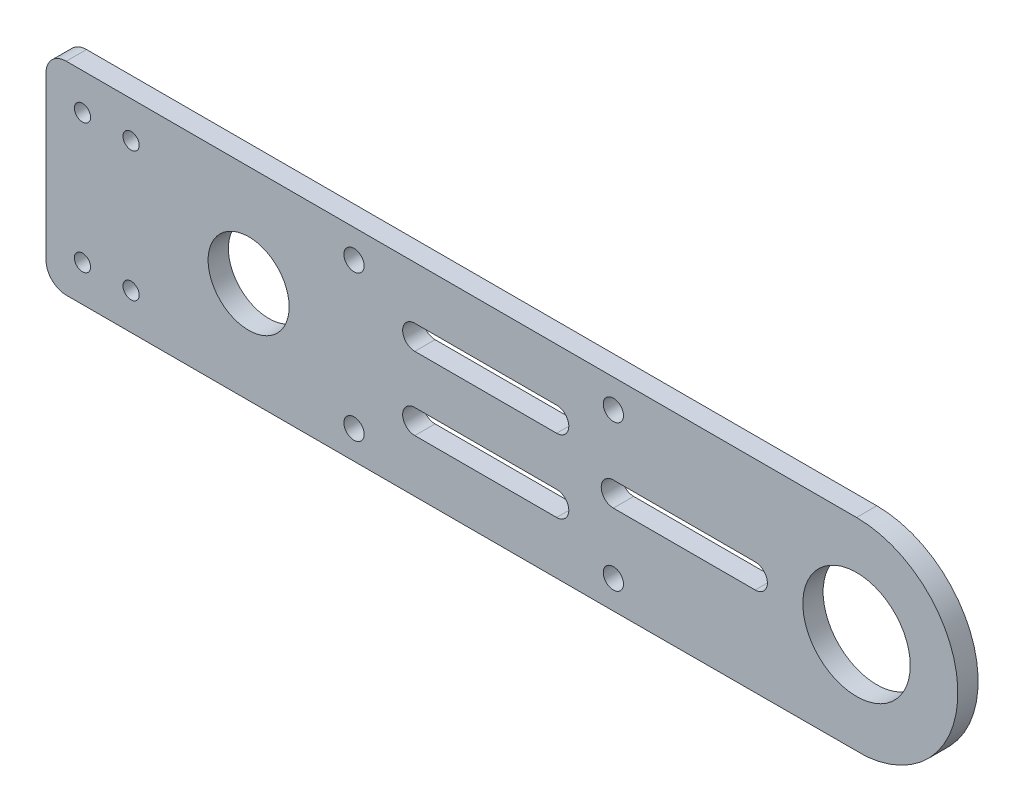
ISO-10303-21;
HEADER;
FILE_DESCRIPTION(('STEP AP214'),'2;1');
FILE_NAME('part.step','',(''),(''),'','','');
FILE_SCHEMA(('AUTOMOTIVE_DESIGN { 1 0 10303 214 1 1 1 1 }'));
ENDSEC;
DATA;
#1=APPLICATION_CONTEXT('core data for automotive mechanical design processes');
#2=APPLICATION_PROTOCOL_DEFINITION('international standard','automotive_design',2000,#1);
#3=PRODUCT_CONTEXT('',#1,'mechanical');
#4=PRODUCT('Part','Part','',(#3));
#5=PRODUCT_RELATED_PRODUCT_CATEGORY('part','',(#4));
#6=PRODUCT_DEFINITION_FORMATION('','',#4);
#7=PRODUCT_DEFINITION_CONTEXT('part definition',#1,'design');
#8=PRODUCT_DEFINITION('design','',#6,#7);
#9=PRODUCT_DEFINITION_SHAPE('','',#8);
#10=(LENGTH_UNIT() NAMED_UNIT(*) SI_UNIT(.MILLI.,.METRE.));
#11=(NAMED_UNIT(*) PLANE_ANGLE_UNIT() SI_UNIT($,.RADIAN.));
#12=(NAMED_UNIT(*) SI_UNIT($,.STERADIAN.) SOLID_ANGLE_UNIT());
#13=UNCERTAINTY_MEASURE_WITH_UNIT(LENGTH_MEASURE(1.E-05),#10,'distance_accuracy_value','');
#14=(GEOMETRIC_REPRESENTATION_CONTEXT(3) GLOBAL_UNCERTAINTY_ASSIGNED_CONTEXT((#13)) GLOBAL_UNIT_ASSIGNED_CONTEXT((#10,
#11,#12)) REPRESENTATION_CONTEXT('',''));
#15=CARTESIAN_POINT('',(0.,0.,0.));
#16=DIRECTION('',(0.,0.,1.));
#17=DIRECTION('',(1.,0.,0.));
#18=AXIS2_PLACEMENT_3D('',#15,#16,#17);
#19=CARTESIAN_POINT('',(184.,0.,5.));
#20=DIRECTION('',(0.,0.,1.));
#21=DIRECTION('',(1.,0.,0.));
#22=AXIS2_PLACEMENT_3D('',#19,#20,#21);
#23=PLANE('',#22);
#24=CARTESIAN_POINT('',(60.,18.,5.));
#25=DIRECTION('',(0.,0.,1.));
#26=DIRECTION('',(1.,0.,0.));
#27=AXIS2_PLACEMENT_3D('',#24,#25,#26);
#28=CIRCLE('',#27,2.50000000000001);
#29=CARTESIAN_POINT('',(62.5,18.,5.));
#30=VERTEX_POINT('',#29);
#31=EDGE_CURVE('E502',#30,#30,#28,.T.);
#32=ORIENTED_EDGE('',*,*,#31,.F.);
#33=EDGE_LOOP('',(#32));
#34=FACE_BOUND('',#33,.T.);
#35=CARTESIAN_POINT('',(5.,16.,5.));
#36=DIRECTION('',(0.,0.,1.));
#37=DIRECTION('',(1.,0.,0.));
#38=AXIS2_PLACEMENT_3D('',#35,#36,#37);
#39=CIRCLE('',#38,2.);
#40=CARTESIAN_POINT('',(7.,16.,5.));
#41=VERTEX_POINT('',#40);
#42=EDGE_CURVE('E514',#41,#41,#39,.T.);
#43=ORIENTED_EDGE('',*,*,#42,.F.);
#44=EDGE_LOOP('',(#43));
#45=FACE_BOUND('',#44,.T.);
#46=CARTESIAN_POINT('',(-7.,16.,5.));
#47=DIRECTION('',(0.,0.,1.));
#48=DIRECTION('',(1.,0.,0.));
#49=AXIS2_PLACEMENT_3D('',#46,#47,#48);
#50=CIRCLE('',#49,2.);
#51=CARTESIAN_POINT('',(-5.,16.,5.));
#52=VERTEX_POINT('',#51);
#53=EDGE_CURVE('E203',#52,#52,#50,.T.);
#54=ORIENTED_EDGE('',*,*,#53,.F.);
#55=EDGE_LOOP('',(#54));
#56=FACE_BOUND('',#55,.T.);
#57=CARTESIAN_POINT('',(184.,0.,5.));
#58=DIRECTION('',(0.,0.,1.));
#59=DIRECTION('',(1.,0.,0.));
#60=AXIS2_PLACEMENT_3D('',#57,#58,#59);
#61=CIRCLE('',#60,13.25);
#62=CARTESIAN_POINT('',(197.25,0.,5.));
#63=VERTEX_POINT('',#62);
#64=EDGE_CURVE('E220',#63,#63,#61,.T.);
#65=ORIENTED_EDGE('',*,*,#64,.F.);
#66=EDGE_LOOP('',(#65));
#67=FACE_BOUND('',#66,.T.);
#68=DIRECTION('',(1.,0.,0.));
#69=VECTOR('',#68,1.);
#70=CARTESIAN_POINT('',(75.,6.,5.));
#71=LINE('',#70,#69);
#72=CARTESIAN_POINT('',(75.,6.,5.));
#73=VERTEX_POINT('',#72);
#74=CARTESIAN_POINT('',(110.,6.,5.));
#75=VERTEX_POINT('',#74);
#76=EDGE_CURVE('E265',#73,#75,#71,.T.);
#77=ORIENTED_EDGE('',*,*,#76,.F.);
#78=CARTESIAN_POINT('',(75.,9.,5.));
#79=DIRECTION('',(0.,0.,1.));
#80=DIRECTION('',(1.,0.,0.));
#81=AXIS2_PLACEMENT_3D('',#78,#79,#80);
#82=CIRCLE('',#81,3.);
#83=CARTESIAN_POINT('',(75.,12.,5.));
#84=VERTEX_POINT('',#83);
#85=EDGE_CURVE('E263',#84,#73,#82,.T.);
#86=ORIENTED_EDGE('',*,*,#85,.F.);
#87=DIRECTION('',(-1.,0.,0.));
#88=VECTOR('',#87,1.);
#89=CARTESIAN_POINT('',(75.,12.,5.));
#90=LINE('',#89,#88);
#91=CARTESIAN_POINT('',(110.,12.,5.));
#92=VERTEX_POINT('',#91);
#93=EDGE_CURVE('E271',#92,#84,#90,.T.);
#94=ORIENTED_EDGE('',*,*,#93,.F.);
#95=CARTESIAN_POINT('',(110.,9.,5.));
#96=DIRECTION('',(0.,0.,1.));
#97=DIRECTION('',(1.,0.,0.));
#98=AXIS2_PLACEMENT_3D('',#95,#96,#97);
#99=CIRCLE('',#98,3.);
#100=EDGE_CURVE('E268',#75,#92,#99,.T.);
#101=ORIENTED_EDGE('',*,*,#100,.F.);
#102=EDGE_LOOP('',(#77,#86,#94,#101));
#103=FACE_BOUND('',#102,.T.);
#104=CARTESIAN_POINT('',(34.,0.,5.));
#105=DIRECTION('',(0.,0.,1.));
#106=DIRECTION('',(1.,0.,0.));
#107=AXIS2_PLACEMENT_3D('',#104,#105,#106);
#108=CIRCLE('',#107,10.);
#109=CARTESIAN_POINT('',(44.,0.,5.));
#110=VERTEX_POINT('',#109);
#111=EDGE_CURVE('E294',#110,#110,#108,.T.);
#112=ORIENTED_EDGE('',*,*,#111,.F.);
#113=EDGE_LOOP('',(#112));
#114=FACE_BOUND('',#113,.T.);
#115=DIRECTION('',(0.,-1.,0.));
#116=VECTOR('',#115,1.);
#117=CARTESIAN_POINT('',(-16.,25.,5.));
#118=LINE('',#117,#116);
#119=CARTESIAN_POINT('',(-16.,20.,5.));
#120=VERTEX_POINT('',#119);
#121=CARTESIAN_POINT('',(-16.,-20.,5.));
#122=VERTEX_POINT('',#121);
#123=EDGE_CURVE('E302',#120,#122,#118,.T.);
#124=ORIENTED_EDGE('',*,*,#123,.T.);
#125=CARTESIAN_POINT('',(-11.,-20.,5.));
#126=DIRECTION('',(0.,0.,1.));
#127=DIRECTION('',(1.,0.,0.));
#128=AXIS2_PLACEMENT_3D('',#125,#126,#127);
#129=CIRCLE('',#128,5.);
#130=CARTESIAN_POINT('',(-11.,-25.,5.));
#131=VERTEX_POINT('',#130);
#132=EDGE_CURVE('E45',#122,#131,#129,.T.);
#133=ORIENTED_EDGE('',*,*,#132,.T.);
#134=DIRECTION('',(1.,0.,0.));
#135=VECTOR('',#134,1.);
#136=CARTESIAN_POINT('',(-16.,-25.,5.));
#137=LINE('',#136,#135);
#138=CARTESIAN_POINT('',(124.869292100737,-25.,5.));
#139=VERTEX_POINT('',#138);
#140=EDGE_CURVE('E305',#131,#139,#137,.T.);
#141=ORIENTED_EDGE('',*,*,#140,.T.);
#142=DIRECTION('',(0.999997963583353,0.00201812515635374,0.));
#143=VECTOR('',#142,1.);
#144=CARTESIAN_POINT('',(124.869292100737,-25.,5.));
#145=LINE('',#144,#143);
#146=CARTESIAN_POINT('',(186.490484141799,-24.8756404689296,5.));
#147=VERTEX_POINT('',#146);
#148=EDGE_CURVE('E307',#139,#147,#145,.T.);
#149=ORIENTED_EDGE('',*,*,#148,.T.);
#150=CARTESIAN_POINT('',(184.,0.,5.));
#151=DIRECTION('',(0.,0.,1.));
#152=DIRECTION('',(1.,0.,0.));
#153=AXIS2_PLACEMENT_3D('',#150,#151,#152);
#154=CIRCLE('',#153,25.);
#155=CARTESIAN_POINT('',(184.,25.,5.));
#156=VERTEX_POINT('',#155);
#157=EDGE_CURVE('E309',#147,#156,#154,.T.);
#158=ORIENTED_EDGE('',*,*,#157,.T.);
#159=DIRECTION('',(-1.,0.,0.));
#160=VECTOR('',#159,1.);
#161=CARTESIAN_POINT('',(0.,25.,5.));
#162=LINE('',#161,#160);
#163=CARTESIAN_POINT('',(-11.,25.,5.));
#164=VERTEX_POINT('',#163);
#165=EDGE_CURVE('E300',#156,#164,#162,.T.);
#166=ORIENTED_EDGE('',*,*,#165,.T.);
#167=CARTESIAN_POINT('',(-11.,20.,5.));
#168=DIRECTION('',(0.,0.,1.));
#169=DIRECTION('',(1.,0.,0.));
#170=AXIS2_PLACEMENT_3D('',#167,#168,#169);
#171=CIRCLE('',#170,5.);
#172=EDGE_CURVE('E341',#164,#120,#171,.T.);
#173=ORIENTED_EDGE('',*,*,#172,.T.);
#174=EDGE_LOOP('',(#124,#133,#141,#149,#158,#166,#173));
#175=FACE_BOUND('',#174,.T.);
#176=CARTESIAN_POINT('',(124.,-18.,5.));
#177=DIRECTION('',(0.,0.,1.));
#178=DIRECTION('',(-1.,0.,0.));
#179=AXIS2_PLACEMENT_3D('',#176,#177,#178);
#180=CIRCLE('',#179,2.5);
#181=CARTESIAN_POINT('',(121.5,-18.,5.));
#182=VERTEX_POINT('',#181);
#183=EDGE_CURVE('E257',#182,#182,#180,.T.);
#184=ORIENTED_EDGE('',*,*,#183,.F.);
#185=EDGE_LOOP('',(#184));
#186=FACE_BOUND('',#185,.T.);
#187=DIRECTION('',(1.,0.,0.));
#188=VECTOR('',#187,1.);
#189=CARTESIAN_POINT('',(75.,-12.,5.));
#190=LINE('',#189,#188);
#191=CARTESIAN_POINT('',(75.,-12.,5.));
#192=VERTEX_POINT('',#191);
#193=CARTESIAN_POINT('',(110.,-12.,5.));
#194=VERTEX_POINT('',#193);
#195=EDGE_CURVE('E228',#192,#194,#190,.T.);
#196=ORIENTED_EDGE('',*,*,#195,.F.);
#197=CARTESIAN_POINT('',(75.,-9.,5.));
#198=DIRECTION('',(0.,0.,1.));
#199=DIRECTION('',(-1.,0.,0.));
#200=AXIS2_PLACEMENT_3D('',#197,#198,#199);
#201=CIRCLE('',#200,3.);
#202=CARTESIAN_POINT('',(75.,-6.,5.));
#203=VERTEX_POINT('',#202);
#204=EDGE_CURVE('E226',#203,#192,#201,.T.);
#205=ORIENTED_EDGE('',*,*,#204,.F.);
#206=DIRECTION('',(-1.,0.,0.));
#207=VECTOR('',#206,1.);
#208=CARTESIAN_POINT('',(75.,-6.,5.));
#209=LINE('',#208,#207);
#210=CARTESIAN_POINT('',(110.,-6.,5.));
#211=VERTEX_POINT('',#210);
#212=EDGE_CURVE('E234',#211,#203,#209,.T.);
#213=ORIENTED_EDGE('',*,*,#212,.F.);
#214=CARTESIAN_POINT('',(110.,-9.,5.));
#215=DIRECTION('',(0.,0.,1.));
#216=DIRECTION('',(-1.,0.,0.));
#217=AXIS2_PLACEMENT_3D('',#214,#215,#216);
#218=CIRCLE('',#217,3.);
#219=EDGE_CURVE('E231',#194,#211,#218,.T.);
#220=ORIENTED_EDGE('',*,*,#219,.F.);
#221=EDGE_LOOP('',(#196,#205,#213,#220));
#222=FACE_BOUND('',#221,.T.);
#223=CARTESIAN_POINT('',(60.,-18.,5.));
#224=DIRECTION('',(0.,0.,1.));
#225=DIRECTION('',(-1.,0.,0.));
#226=AXIS2_PLACEMENT_3D('',#223,#224,#225);
#227=CIRCLE('',#226,2.50000000000001);
#228=CARTESIAN_POINT('',(57.5,-18.,5.));
#229=VERTEX_POINT('',#228);
#230=EDGE_CURVE('E214',#229,#229,#227,.T.);
#231=ORIENTED_EDGE('',*,*,#230,.F.);
#232=EDGE_LOOP('',(#231));
#233=FACE_BOUND('',#232,.T.);
#234=DIRECTION('',(1.,0.,0.));
#235=VECTOR('',#234,1.);
#236=CARTESIAN_POINT('',(124.,-3.,5.));
#237=LINE('',#236,#235);
#238=CARTESIAN_POINT('',(124.,-3.,5.));
#239=VERTEX_POINT('',#238);
#240=CARTESIAN_POINT('',(159.,-3.,5.));
#241=VERTEX_POINT('',#240);
#242=EDGE_CURVE('E180',#239,#241,#237,.T.);
#243=ORIENTED_EDGE('',*,*,#242,.F.);
#244=CARTESIAN_POINT('',(124.,0.,5.));
#245=DIRECTION('',(0.,0.,1.));
#246=DIRECTION('',(1.,0.,0.));
#247=AXIS2_PLACEMENT_3D('',#244,#245,#246);
#248=CIRCLE('',#247,3.);
#249=CARTESIAN_POINT('',(124.,3.,5.));
#250=VERTEX_POINT('',#249);
#251=EDGE_CURVE('E170',#250,#239,#248,.T.);
#252=ORIENTED_EDGE('',*,*,#251,.F.);
#253=DIRECTION('',(-1.,0.,0.));
#254=VECTOR('',#253,1.);
#255=CARTESIAN_POINT('',(124.,3.,5.));
#256=LINE('',#255,#254);
#257=CARTESIAN_POINT('',(159.,3.,5.));
#258=VERTEX_POINT('',#257);
#259=EDGE_CURVE('E196',#258,#250,#256,.T.);
#260=ORIENTED_EDGE('',*,*,#259,.F.);
#261=CARTESIAN_POINT('',(159.,0.,5.));
#262=DIRECTION('',(0.,0.,1.));
#263=DIRECTION('',(1.,0.,0.));
#264=AXIS2_PLACEMENT_3D('',#261,#262,#263);
#265=CIRCLE('',#264,3.);
#266=EDGE_CURVE('E194',#241,#258,#265,.T.);
#267=ORIENTED_EDGE('',*,*,#266,.F.);
#268=EDGE_LOOP('',(#243,#252,#260,#267));
#269=FACE_BOUND('',#268,.T.);
#270=CARTESIAN_POINT('',(-7.,-16.,5.));
#271=DIRECTION('',(0.,0.,1.));
#272=DIRECTION('',(-1.,0.,0.));
#273=AXIS2_PLACEMENT_3D('',#270,#271,#272);
#274=CIRCLE('',#273,2.);
#275=CARTESIAN_POINT('',(-9.,-16.,5.));
#276=VERTEX_POINT('',#275);
#277=EDGE_CURVE('E520',#276,#276,#274,.T.);
#278=ORIENTED_EDGE('',*,*,#277,.F.);
#279=EDGE_LOOP('',(#278));
#280=FACE_BOUND('',#279,.T.);
#281=CARTESIAN_POINT('',(5.,-16.,5.));
#282=DIRECTION('',(0.,0.,1.));
#283=DIRECTION('',(-1.,0.,0.));
#284=AXIS2_PLACEMENT_3D('',#281,#282,#283);
#285=CIRCLE('',#284,2.);
#286=CARTESIAN_POINT('',(3.,-16.,5.));
#287=VERTEX_POINT('',#286);
#288=EDGE_CURVE('E508',#287,#287,#285,.T.);
#289=ORIENTED_EDGE('',*,*,#288,.F.);
#290=EDGE_LOOP('',(#289));
#291=FACE_BOUND('',#290,.T.);
#292=CARTESIAN_POINT('',(124.,18.,5.));
#293=DIRECTION('',(0.,0.,1.));
#294=DIRECTION('',(1.,0.,0.));
#295=AXIS2_PLACEMENT_3D('',#292,#293,#294);
#296=CIRCLE('',#295,2.5);
#297=CARTESIAN_POINT('',(126.5,18.,5.));
#298=VERTEX_POINT('',#297);
#299=EDGE_CURVE('E493',#298,#298,#296,.T.);
#300=ORIENTED_EDGE('',*,*,#299,.F.);
#301=EDGE_LOOP('',(#300));
#302=FACE_BOUND('',#301,.T.);
#303=ADVANCED_FACE('F37',(#34,#45,#56,#67,#103,#114,#175,#186,#222,#233,#269,#280,#291,#302),
#23,.T.);
#304=CARTESIAN_POINT('',(184.,0.,0.));
#305=DIRECTION('',(0.,0.,1.));
#306=DIRECTION('',(1.,0.,0.));
#307=AXIS2_PLACEMENT_3D('',#304,#305,#306);
#308=PLANE('',#307);
#309=CARTESIAN_POINT('',(60.,-18.,0.));
#310=DIRECTION('',(0.,0.,1.));
#311=DIRECTION('',(-1.,0.,0.));
#312=AXIS2_PLACEMENT_3D('',#309,#310,#311);
#313=CIRCLE('',#312,2.50000000000001);
#314=CARTESIAN_POINT('',(57.5,-18.,0.));
#315=VERTEX_POINT('',#314);
#316=EDGE_CURVE('E188',#315,#315,#313,.T.);
#317=ORIENTED_EDGE('',*,*,#316,.T.);
#318=EDGE_LOOP('',(#317));
#319=FACE_BOUND('',#318,.T.);
#320=CARTESIAN_POINT('',(184.,0.,0.));
#321=DIRECTION('',(0.,0.,1.));
#322=DIRECTION('',(1.,0.,0.));
#323=AXIS2_PLACEMENT_3D('',#320,#321,#322);
#324=CIRCLE('',#323,13.25);
#325=CARTESIAN_POINT('',(197.25,0.,0.));
#326=VERTEX_POINT('',#325);
#327=EDGE_CURVE('E217',#326,#326,#324,.T.);
#328=ORIENTED_EDGE('',*,*,#327,.T.);
#329=EDGE_LOOP('',(#328));
#330=FACE_BOUND('',#329,.T.);
#331=CARTESIAN_POINT('',(75.,-9.,0.));
#332=DIRECTION('',(0.,0.,1.));
#333=DIRECTION('',(-1.,0.,0.));
#334=AXIS2_PLACEMENT_3D('',#331,#332,#333);
#335=CIRCLE('',#334,3.);
#336=CARTESIAN_POINT('',(75.,-6.,0.));
#337=VERTEX_POINT('',#336);
#338=CARTESIAN_POINT('',(75.,-12.,0.));
#339=VERTEX_POINT('',#338);
#340=EDGE_CURVE('E223',#337,#339,#335,.T.);
#341=ORIENTED_EDGE('',*,*,#340,.T.);
#342=DIRECTION('',(1.,0.,0.));
#343=VECTOR('',#342,1.);
#344=CARTESIAN_POINT('',(75.,-12.,0.));
#345=LINE('',#344,#343);
#346=CARTESIAN_POINT('',(110.,-12.,0.));
#347=VERTEX_POINT('',#346);
#348=EDGE_CURVE('E239',#339,#347,#345,.T.);
#349=ORIENTED_EDGE('',*,*,#348,.T.);
#350=CARTESIAN_POINT('',(110.,-9.,0.));
#351=DIRECTION('',(0.,0.,1.));
#352=DIRECTION('',(-1.,0.,0.));
#353=AXIS2_PLACEMENT_3D('',#350,#351,#352);
#354=CIRCLE('',#353,3.);
#355=CARTESIAN_POINT('',(110.,-6.,0.));
#356=VERTEX_POINT('',#355);
#357=EDGE_CURVE('E242',#347,#356,#354,.T.);
#358=ORIENTED_EDGE('',*,*,#357,.T.);
#359=DIRECTION('',(-1.,0.,0.));
#360=VECTOR('',#359,1.);
#361=CARTESIAN_POINT('',(75.,-6.,0.));
#362=LINE('',#361,#360);
#363=EDGE_CURVE('E229',#356,#337,#362,.T.);
#364=ORIENTED_EDGE('',*,*,#363,.T.);
#365=EDGE_LOOP('',(#341,#349,#358,#364));
#366=FACE_BOUND('',#365,.T.);
#367=CARTESIAN_POINT('',(34.,0.,0.));
#368=DIRECTION('',(0.,0.,1.));
#369=DIRECTION('',(1.,0.,0.));
#370=AXIS2_PLACEMENT_3D('',#367,#368,#369);
#371=CIRCLE('',#370,10.);
#372=CARTESIAN_POINT('',(44.,0.,0.));
#373=VERTEX_POINT('',#372);
#374=EDGE_CURVE('E293',#373,#373,#371,.T.);
#375=ORIENTED_EDGE('',*,*,#374,.T.);
#376=EDGE_LOOP('',(#375));
#377=FACE_BOUND('',#376,.T.);
#378=DIRECTION('',(1.,0.,0.));
#379=VECTOR('',#378,1.);
#380=CARTESIAN_POINT('',(0.,-25.,0.));
#381=LINE('',#380,#379);
#382=CARTESIAN_POINT('',(-11.,-25.,0.));
#383=VERTEX_POINT('',#382);
#384=CARTESIAN_POINT('',(124.869292100737,-25.,0.));
#385=VERTEX_POINT('',#384);
#386=EDGE_CURVE('E314',#383,#385,#381,.T.);
#387=ORIENTED_EDGE('',*,*,#386,.F.);
#388=CARTESIAN_POINT('',(-11.,-20.,0.));
#389=DIRECTION('',(0.,0.,1.));
#390=DIRECTION('',(1.,0.,0.));
#391=AXIS2_PLACEMENT_3D('',#388,#389,#390);
#392=CIRCLE('',#391,5.);
#393=CARTESIAN_POINT('',(-16.,-20.,0.));
#394=VERTEX_POINT('',#393);
#395=EDGE_CURVE('E335',#383,#394,#392,.F.);
#396=ORIENTED_EDGE('',*,*,#395,.T.);
#397=DIRECTION('',(0.,-1.,0.));
#398=VECTOR('',#397,1.);
#399=CARTESIAN_POINT('',(-16.,25.,0.));
#400=LINE('',#399,#398);
#401=CARTESIAN_POINT('',(-16.,20.,0.));
#402=VERTEX_POINT('',#401);
#403=EDGE_CURVE('E297',#402,#394,#400,.T.);
#404=ORIENTED_EDGE('',*,*,#403,.F.);
#405=CARTESIAN_POINT('',(-11.,20.,0.));
#406=DIRECTION('',(0.,0.,1.));
#407=DIRECTION('',(1.,0.,0.));
#408=AXIS2_PLACEMENT_3D('',#405,#406,#407);
#409=CIRCLE('',#408,5.);
#410=CARTESIAN_POINT('',(-11.,25.,0.));
#411=VERTEX_POINT('',#410);
#412=EDGE_CURVE('E333',#402,#411,#409,.F.);
#413=ORIENTED_EDGE('',*,*,#412,.T.);
#414=DIRECTION('',(-1.,0.,0.));
#415=VECTOR('',#414,1.);
#416=CARTESIAN_POINT('',(0.,25.,0.));
#417=LINE('',#416,#415);
#418=CARTESIAN_POINT('',(184.,25.,0.));
#419=VERTEX_POINT('',#418);
#420=EDGE_CURVE('E303',#419,#411,#417,.T.);
#421=ORIENTED_EDGE('',*,*,#420,.F.);
#422=CARTESIAN_POINT('',(184.,0.,0.));
#423=DIRECTION('',(0.,0.,1.));
#424=DIRECTION('',(1.,0.,0.));
#425=AXIS2_PLACEMENT_3D('',#422,#423,#424);
#426=CIRCLE('',#425,25.);
#427=CARTESIAN_POINT('',(186.490484141799,-24.8756404689296,0.));
#428=VERTEX_POINT('',#427);
#429=EDGE_CURVE('E318',#428,#419,#426,.T.);
#430=ORIENTED_EDGE('',*,*,#429,.F.);
#431=DIRECTION('',(0.999997963583353,0.00201812515635374,0.));
#432=VECTOR('',#431,1.);
#433=CARTESIAN_POINT('',(124.869292100737,-25.,0.));
#434=LINE('',#433,#432);
#435=EDGE_CURVE('E316',#385,#428,#434,.T.);
#436=ORIENTED_EDGE('',*,*,#435,.F.);
#437=EDGE_LOOP('',(#387,#396,#404,#413,#421,#430,#436));
#438=FACE_BOUND('',#437,.T.);
#439=CARTESIAN_POINT('',(75.,9.,0.));
#440=DIRECTION('',(0.,0.,1.));
#441=DIRECTION('',(1.,0.,0.));
#442=AXIS2_PLACEMENT_3D('',#439,#440,#441);
#443=CIRCLE('',#442,3.);
#444=CARTESIAN_POINT('',(75.,12.,0.));
#445=VERTEX_POINT('',#444);
#446=CARTESIAN_POINT('',(75.,6.,0.));
#447=VERTEX_POINT('',#446);
#448=EDGE_CURVE('E260',#445,#447,#443,.T.);
#449=ORIENTED_EDGE('',*,*,#448,.T.);
#450=DIRECTION('',(1.,0.,0.));
#451=VECTOR('',#450,1.);
#452=CARTESIAN_POINT('',(75.,6.,0.));
#453=LINE('',#452,#451);
#454=CARTESIAN_POINT('',(110.,6.,0.));
#455=VERTEX_POINT('',#454);
#456=EDGE_CURVE('E276',#447,#455,#453,.T.);
#457=ORIENTED_EDGE('',*,*,#456,.T.);
#458=CARTESIAN_POINT('',(110.,9.,0.));
#459=DIRECTION('',(0.,0.,1.));
#460=DIRECTION('',(1.,0.,0.));
#461=AXIS2_PLACEMENT_3D('',#458,#459,#460);
#462=CIRCLE('',#461,3.);
#463=CARTESIAN_POINT('',(110.,12.,0.));
#464=VERTEX_POINT('',#463);
#465=EDGE_CURVE('E279',#455,#464,#462,.T.);
#466=ORIENTED_EDGE('',*,*,#465,.T.);
#467=DIRECTION('',(-1.,0.,0.));
#468=VECTOR('',#467,1.);
#469=CARTESIAN_POINT('',(75.,12.,0.));
#470=LINE('',#469,#468);
#471=EDGE_CURVE('E266',#464,#445,#470,.T.);
#472=ORIENTED_EDGE('',*,*,#471,.T.);
#473=EDGE_LOOP('',(#449,#457,#466,#472));
#474=FACE_BOUND('',#473,.T.);
#475=CARTESIAN_POINT('',(124.,-18.,0.));
#476=DIRECTION('',(0.,0.,1.));
#477=DIRECTION('',(-1.,0.,0.));
#478=AXIS2_PLACEMENT_3D('',#475,#476,#477);
#479=CIRCLE('',#478,2.5);
#480=CARTESIAN_POINT('',(121.5,-18.,0.));
#481=VERTEX_POINT('',#480);
#482=EDGE_CURVE('E256',#481,#481,#479,.T.);
#483=ORIENTED_EDGE('',*,*,#482,.T.);
#484=EDGE_LOOP('',(#483));
#485=FACE_BOUND('',#484,.T.);
#486=CARTESIAN_POINT('',(124.,0.,0.));
#487=DIRECTION('',(0.,0.,1.));
#488=DIRECTION('',(1.,0.,0.));
#489=AXIS2_PLACEMENT_3D('',#486,#487,#488);
#490=CIRCLE('',#489,3.);
#491=CARTESIAN_POINT('',(124.,3.,0.));
#492=VERTEX_POINT('',#491);
#493=CARTESIAN_POINT('',(124.,-3.,0.));
#494=VERTEX_POINT('',#493);
#495=EDGE_CURVE('E201',#492,#494,#490,.T.);
#496=ORIENTED_EDGE('',*,*,#495,.T.);
#497=DIRECTION('',(1.,0.,0.));
#498=VECTOR('',#497,1.);
#499=CARTESIAN_POINT('',(124.,-3.,0.));
#500=LINE('',#499,#498);
#501=CARTESIAN_POINT('',(159.,-3.,0.));
#502=VERTEX_POINT('',#501);
#503=EDGE_CURVE('E187',#494,#502,#500,.T.);
#504=ORIENTED_EDGE('',*,*,#503,.T.);
#505=CARTESIAN_POINT('',(159.,0.,0.));
#506=DIRECTION('',(0.,0.,1.));
#507=DIRECTION('',(1.,0.,0.));
#508=AXIS2_PLACEMENT_3D('',#505,#506,#507);
#509=CIRCLE('',#508,3.);
#510=CARTESIAN_POINT('',(159.,3.,0.));
#511=VERTEX_POINT('',#510);
#512=EDGE_CURVE('E205',#502,#511,#509,.T.);
#513=ORIENTED_EDGE('',*,*,#512,.T.);
#514=DIRECTION('',(-1.,0.,0.));
#515=VECTOR('',#514,1.);
#516=CARTESIAN_POINT('',(124.,3.,0.));
#517=LINE('',#516,#515);
#518=EDGE_CURVE('E181',#511,#492,#517,.T.);
#519=ORIENTED_EDGE('',*,*,#518,.T.);
#520=EDGE_LOOP('',(#496,#504,#513,#519));
#521=FACE_BOUND('',#520,.T.);
#522=CARTESIAN_POINT('',(-7.,16.,0.));
#523=DIRECTION('',(0.,0.,1.));
#524=DIRECTION('',(1.,0.,0.));
#525=AXIS2_PLACEMENT_3D('',#522,#523,#524);
#526=CIRCLE('',#525,2.);
#527=CARTESIAN_POINT('',(-5.,16.,0.));
#528=VERTEX_POINT('',#527);
#529=EDGE_CURVE('E523',#528,#528,#526,.T.);
#530=ORIENTED_EDGE('',*,*,#529,.T.);
#531=EDGE_LOOP('',(#530));
#532=FACE_BOUND('',#531,.T.);
#533=CARTESIAN_POINT('',(-7.,-16.,0.));
#534=DIRECTION('',(0.,0.,1.));
#535=DIRECTION('',(-1.,0.,0.));
#536=AXIS2_PLACEMENT_3D('',#533,#534,#535);
#537=CIRCLE('',#536,2.);
#538=CARTESIAN_POINT('',(-9.,-16.,0.));
#539=VERTEX_POINT('',#538);
#540=EDGE_CURVE('E517',#539,#539,#537,.T.);
#541=ORIENTED_EDGE('',*,*,#540,.T.);
#542=EDGE_LOOP('',(#541));
#543=FACE_BOUND('',#542,.T.);
#544=CARTESIAN_POINT('',(5.,16.,0.));
#545=DIRECTION('',(0.,0.,1.));
#546=DIRECTION('',(1.,0.,0.));
#547=AXIS2_PLACEMENT_3D('',#544,#545,#546);
#548=CIRCLE('',#547,2.);
#549=CARTESIAN_POINT('',(7.,16.,0.));
#550=VERTEX_POINT('',#549);
#551=EDGE_CURVE('E511',#550,#550,#548,.T.);
#552=ORIENTED_EDGE('',*,*,#551,.T.);
#553=EDGE_LOOP('',(#552));
#554=FACE_BOUND('',#553,.T.);
#555=CARTESIAN_POINT('',(5.,-16.,0.));
#556=DIRECTION('',(0.,0.,1.));
#557=DIRECTION('',(-1.,0.,0.));
#558=AXIS2_PLACEMENT_3D('',#555,#556,#557);
#559=CIRCLE('',#558,2.);
#560=CARTESIAN_POINT('',(3.,-16.,0.));
#561=VERTEX_POINT('',#560);
#562=EDGE_CURVE('E505',#561,#561,#559,.T.);
#563=ORIENTED_EDGE('',*,*,#562,.T.);
#564=EDGE_LOOP('',(#563));
#565=FACE_BOUND('',#564,.T.);
#566=CARTESIAN_POINT('',(60.,18.,0.));
#567=DIRECTION('',(0.,0.,1.));
#568=DIRECTION('',(1.,0.,0.));
#569=AXIS2_PLACEMENT_3D('',#566,#567,#568);
#570=CIRCLE('',#569,2.50000000000001);
#571=CARTESIAN_POINT('',(62.5,18.,0.));
#572=VERTEX_POINT('',#571);
#573=EDGE_CURVE('E499',#572,#572,#570,.T.);
#574=ORIENTED_EDGE('',*,*,#573,.T.);
#575=EDGE_LOOP('',(#574));
#576=FACE_BOUND('',#575,.T.);
#577=CARTESIAN_POINT('',(124.,18.,0.));
#578=DIRECTION('',(0.,0.,1.));
#579=DIRECTION('',(1.,0.,0.));
#580=AXIS2_PLACEMENT_3D('',#577,#578,#579);
#581=CIRCLE('',#580,2.5);
#582=CARTESIAN_POINT('',(126.5,18.,0.));
#583=VERTEX_POINT('',#582);
#584=EDGE_CURVE('E496',#583,#583,#581,.T.);
#585=ORIENTED_EDGE('',*,*,#584,.T.);
#586=EDGE_LOOP('',(#585));
#587=FACE_BOUND('',#586,.T.);
#588=ADVANCED_FACE('F356',(#319,#330,#366,#377,#438,#474,#485,#521,#532,#543,#554,#565,#576,
#587),#308,.F.);
#589=CARTESIAN_POINT('',(-16.,25.,5.));
#590=DIRECTION('',(1.,0.,0.));
#591=DIRECTION('',(0.,0.,-1.));
#592=AXIS2_PLACEMENT_3D('',#589,#590,#591);
#593=PLANE('',#592);
#594=ORIENTED_EDGE('',*,*,#403,.T.);
#595=DIRECTION('',(0.,0.,-1.));
#596=VECTOR('',#595,1.);
#597=CARTESIAN_POINT('',(-16.,-20.,5.));
#598=LINE('',#597,#596);
#599=EDGE_CURVE('E58',#394,#122,#598,.F.);
#600=ORIENTED_EDGE('',*,*,#599,.T.);
#601=ORIENTED_EDGE('',*,*,#123,.F.);
#602=DIRECTION('',(0.,0.,-1.));
#603=VECTOR('',#602,1.);
#604=CARTESIAN_POINT('',(-16.,20.,5.));
#605=LINE('',#604,#603);
#606=EDGE_CURVE('E337',#120,#402,#605,.T.);
#607=ORIENTED_EDGE('',*,*,#606,.T.);
#608=EDGE_LOOP('',(#594,#600,#601,#607));
#609=FACE_BOUND('',#608,.T.);
#610=ADVANCED_FACE('F359',(#609),#593,.F.);
#611=CARTESIAN_POINT('',(0.,-25.,5.));
#612=DIRECTION('',(0.,1.,0.));
#613=DIRECTION('',(0.,0.,1.));
#614=AXIS2_PLACEMENT_3D('',#611,#612,#613);
#615=PLANE('',#614);
#616=ORIENTED_EDGE('',*,*,#140,.F.);
#617=DIRECTION('',(0.,0.,-1.));
#618=VECTOR('',#617,1.);
#619=CARTESIAN_POINT('',(-11.,-25.,5.));
#620=LINE('',#619,#618);
#621=EDGE_CURVE('E330',#131,#383,#620,.T.);
#622=ORIENTED_EDGE('',*,*,#621,.T.);
#623=ORIENTED_EDGE('',*,*,#386,.T.);
#624=DIRECTION('',(0.,0.,-1.));
#625=VECTOR('',#624,1.);
#626=CARTESIAN_POINT('',(124.869292100737,-25.,5.));
#627=LINE('',#626,#625);
#628=EDGE_CURVE('E327',#139,#385,#627,.T.);
#629=ORIENTED_EDGE('',*,*,#628,.F.);
#630=EDGE_LOOP('',(#616,#622,#623,#629));
#631=FACE_BOUND('',#630,.T.);
#632=ADVANCED_FACE('F350',(#631),#615,.F.);
#633=CARTESIAN_POINT('',(124.869292100737,-25.,5.));
#634=DIRECTION('',(-0.00201812515635374,0.999997963583353,0.));
#635=DIRECTION('',(-0.999997963583353,-0.00201812515635374,0.));
#636=AXIS2_PLACEMENT_3D('',#633,#634,#635);
#637=PLANE('',#636);
#638=ORIENTED_EDGE('',*,*,#435,.T.);
#639=DIRECTION('',(0.,0.,-1.));
#640=VECTOR('',#639,1.);
#641=CARTESIAN_POINT('',(186.490484141799,-24.8756404689296,5.));
#642=LINE('',#641,#640);
#643=EDGE_CURVE('E324',#147,#428,#642,.T.);
#644=ORIENTED_EDGE('',*,*,#643,.F.);
#645=ORIENTED_EDGE('',*,*,#148,.F.);
#646=ORIENTED_EDGE('',*,*,#628,.T.);
#647=EDGE_LOOP('',(#638,#644,#645,#646));
#648=FACE_BOUND('',#647,.T.);
#649=ADVANCED_FACE('F371',(#648),#637,.F.);
#650=CARTESIAN_POINT('',(184.,0.,5.));
#651=DIRECTION('',(0.,0.,-1.));
#652=DIRECTION('',(-1.,0.,0.));
#653=AXIS2_PLACEMENT_3D('',#650,#651,#652);
#654=CYLINDRICAL_SURFACE('',#653,25.);
#655=ORIENTED_EDGE('',*,*,#429,.T.);
#656=DIRECTION('',(0.,0.,-1.));
#657=VECTOR('',#656,1.);
#658=CARTESIAN_POINT('',(184.,25.,5.));
#659=LINE('',#658,#657);
#660=EDGE_CURVE('E312',#156,#419,#659,.T.);
#661=ORIENTED_EDGE('',*,*,#660,.F.);
#662=ORIENTED_EDGE('',*,*,#157,.F.);
#663=ORIENTED_EDGE('',*,*,#643,.T.);
#664=EDGE_LOOP('',(#655,#661,#662,#663));
#665=FACE_BOUND('',#664,.T.);
#666=ADVANCED_FACE('F368',(#665),#654,.T.);
#667=CARTESIAN_POINT('',(0.,25.,5.));
#668=DIRECTION('',(0.,-1.,0.));
#669=DIRECTION('',(0.,0.,-1.));
#670=AXIS2_PLACEMENT_3D('',#667,#668,#669);
#671=PLANE('',#670);
#672=ORIENTED_EDGE('',*,*,#420,.T.);
#673=DIRECTION('',(0.,0.,-1.));
#674=VECTOR('',#673,1.);
#675=CARTESIAN_POINT('',(-11.,25.,5.));
#676=LINE('',#675,#674);
#677=EDGE_CURVE('E11',#411,#164,#676,.F.);
#678=ORIENTED_EDGE('',*,*,#677,.T.);
#679=ORIENTED_EDGE('',*,*,#165,.F.);
#680=ORIENTED_EDGE('',*,*,#660,.T.);
#681=EDGE_LOOP('',(#672,#678,#679,#680));
#682=FACE_BOUND('',#681,.T.);
#683=ADVANCED_FACE('F364',(#682),#671,.F.);
#684=CARTESIAN_POINT('',(34.,0.,5.));
#685=DIRECTION('',(0.,0.,-1.));
#686=DIRECTION('',(-1.,0.,0.));
#687=AXIS2_PLACEMENT_3D('',#684,#685,#686);
#688=CYLINDRICAL_SURFACE('',#687,10.);
#689=ORIENTED_EDGE('',*,*,#111,.T.);
#690=EDGE_LOOP('',(#689));
#691=FACE_BOUND('',#690,.T.);
#692=ORIENTED_EDGE('',*,*,#374,.F.);
#693=EDGE_LOOP('',(#692));
#694=FACE_BOUND('',#693,.T.);
#695=ADVANCED_FACE('F391',(#691,#694),#688,.F.);
#696=CARTESIAN_POINT('',(75.,9.,5.));
#697=DIRECTION('',(0.,0.,-1.));
#698=DIRECTION('',(-1.,0.,0.));
#699=AXIS2_PLACEMENT_3D('',#696,#697,#698);
#700=CYLINDRICAL_SURFACE('',#699,3.);
#701=ORIENTED_EDGE('',*,*,#448,.F.);
#702=DIRECTION('',(0.,0.,-1.));
#703=VECTOR('',#702,1.);
#704=CARTESIAN_POINT('',(75.,12.,5.));
#705=LINE('',#704,#703);
#706=EDGE_CURVE('E273',#84,#445,#705,.T.);
#707=ORIENTED_EDGE('',*,*,#706,.F.);
#708=ORIENTED_EDGE('',*,*,#85,.T.);
#709=DIRECTION('',(0.,0.,-1.));
#710=VECTOR('',#709,1.);
#711=CARTESIAN_POINT('',(75.,6.,5.));
#712=LINE('',#711,#710);
#713=EDGE_CURVE('E290',#73,#447,#712,.T.);
#714=ORIENTED_EDGE('',*,*,#713,.T.);
#715=EDGE_LOOP('',(#701,#707,#708,#714));
#716=FACE_BOUND('',#715,.T.);
#717=ADVANCED_FACE('F398',(#716),#700,.F.);
#718=CARTESIAN_POINT('',(75.,6.,5.));
#719=DIRECTION('',(0.,1.,0.));
#720=DIRECTION('',(0.,0.,1.));
#721=AXIS2_PLACEMENT_3D('',#718,#719,#720);
#722=PLANE('',#721);
#723=ORIENTED_EDGE('',*,*,#456,.F.);
#724=ORIENTED_EDGE('',*,*,#713,.F.);
#725=ORIENTED_EDGE('',*,*,#76,.T.);
#726=DIRECTION('',(0.,0.,-1.));
#727=VECTOR('',#726,1.);
#728=CARTESIAN_POINT('',(110.,6.,5.));
#729=LINE('',#728,#727);
#730=EDGE_CURVE('E288',#75,#455,#729,.T.);
#731=ORIENTED_EDGE('',*,*,#730,.T.);
#732=EDGE_LOOP('',(#723,#724,#725,#731));
#733=FACE_BOUND('',#732,.T.);
#734=ADVANCED_FACE('F403',(#733),#722,.T.);
#735=CARTESIAN_POINT('',(110.,9.,5.));
#736=DIRECTION('',(0.,0.,-1.));
#737=DIRECTION('',(-1.,0.,0.));
#738=AXIS2_PLACEMENT_3D('',#735,#736,#737);
#739=CYLINDRICAL_SURFACE('',#738,3.);
#740=ORIENTED_EDGE('',*,*,#465,.F.);
#741=ORIENTED_EDGE('',*,*,#730,.F.);
#742=ORIENTED_EDGE('',*,*,#100,.T.);
#743=DIRECTION('',(0.,0.,-1.));
#744=VECTOR('',#743,1.);
#745=CARTESIAN_POINT('',(110.,12.,5.));
#746=LINE('',#745,#744);
#747=EDGE_CURVE('E286',#92,#464,#746,.T.);
#748=ORIENTED_EDGE('',*,*,#747,.T.);
#749=EDGE_LOOP('',(#740,#741,#742,#748));
#750=FACE_BOUND('',#749,.T.);
#751=ADVANCED_FACE('F413',(#750),#739,.F.);
#752=CARTESIAN_POINT('',(75.,12.,5.));
#753=DIRECTION('',(0.,-1.,0.));
#754=DIRECTION('',(0.,0.,-1.));
#755=AXIS2_PLACEMENT_3D('',#752,#753,#754);
#756=PLANE('',#755);
#757=ORIENTED_EDGE('',*,*,#471,.F.);
#758=ORIENTED_EDGE('',*,*,#747,.F.);
#759=ORIENTED_EDGE('',*,*,#93,.T.);
#760=ORIENTED_EDGE('',*,*,#706,.T.);
#761=EDGE_LOOP('',(#757,#758,#759,#760));
#762=FACE_BOUND('',#761,.T.);
#763=ADVANCED_FACE('F419',(#762),#756,.T.);
#764=CARTESIAN_POINT('',(124.,-18.,5.));
#765=DIRECTION('',(0.,0.,-1.));
#766=DIRECTION('',(-1.,0.,0.));
#767=AXIS2_PLACEMENT_3D('',#764,#765,#766);
#768=CYLINDRICAL_SURFACE('',#767,2.5);
#769=ORIENTED_EDGE('',*,*,#183,.T.);
#770=EDGE_LOOP('',(#769));
#771=FACE_BOUND('',#770,.T.);
#772=ORIENTED_EDGE('',*,*,#482,.F.);
#773=EDGE_LOOP('',(#772));
#774=FACE_BOUND('',#773,.T.);
#775=ADVANCED_FACE('F423',(#771,#774),#768,.F.);
#776=CARTESIAN_POINT('',(75.,-9.,5.));
#777=DIRECTION('',(0.,0.,-1.));
#778=DIRECTION('',(-1.,0.,0.));
#779=AXIS2_PLACEMENT_3D('',#776,#777,#778);
#780=CYLINDRICAL_SURFACE('',#779,3.);
#781=ORIENTED_EDGE('',*,*,#340,.F.);
#782=DIRECTION('',(0.,0.,-1.));
#783=VECTOR('',#782,1.);
#784=CARTESIAN_POINT('',(75.,-6.,5.));
#785=LINE('',#784,#783);
#786=EDGE_CURVE('E236',#203,#337,#785,.T.);
#787=ORIENTED_EDGE('',*,*,#786,.F.);
#788=ORIENTED_EDGE('',*,*,#204,.T.);
#789=DIRECTION('',(0.,0.,-1.));
#790=VECTOR('',#789,1.);
#791=CARTESIAN_POINT('',(75.,-12.,5.));
#792=LINE('',#791,#790);
#793=EDGE_CURVE('E253',#192,#339,#792,.T.);
#794=ORIENTED_EDGE('',*,*,#793,.T.);
#795=EDGE_LOOP('',(#781,#787,#788,#794));
#796=FACE_BOUND('',#795,.T.);
#797=ADVANCED_FACE('F427',(#796),#780,.F.);
#798=CARTESIAN_POINT('',(75.,-12.,5.));
#799=DIRECTION('',(0.,1.,0.));
#800=DIRECTION('',(0.,0.,1.));
#801=AXIS2_PLACEMENT_3D('',#798,#799,#800);
#802=PLANE('',#801);
#803=ORIENTED_EDGE('',*,*,#348,.F.);
#804=ORIENTED_EDGE('',*,*,#793,.F.);
#805=ORIENTED_EDGE('',*,*,#195,.T.);
#806=DIRECTION('',(0.,0.,-1.));
#807=VECTOR('',#806,1.);
#808=CARTESIAN_POINT('',(110.,-12.,5.));
#809=LINE('',#808,#807);
#810=EDGE_CURVE('E251',#194,#347,#809,.T.);
#811=ORIENTED_EDGE('',*,*,#810,.T.);
#812=EDGE_LOOP('',(#803,#804,#805,#811));
#813=FACE_BOUND('',#812,.T.);
#814=ADVANCED_FACE('F431',(#813),#802,.T.);
#815=CARTESIAN_POINT('',(110.,-9.,5.));
#816=DIRECTION('',(0.,0.,-1.));
#817=DIRECTION('',(-1.,0.,0.));
#818=AXIS2_PLACEMENT_3D('',#815,#816,#817);
#819=CYLINDRICAL_SURFACE('',#818,3.);
#820=ORIENTED_EDGE('',*,*,#357,.F.);
#821=ORIENTED_EDGE('',*,*,#810,.F.);
#822=ORIENTED_EDGE('',*,*,#219,.T.);
#823=DIRECTION('',(0.,0.,-1.));
#824=VECTOR('',#823,1.);
#825=CARTESIAN_POINT('',(110.,-6.,5.));
#826=LINE('',#825,#824);
#827=EDGE_CURVE('E249',#211,#356,#826,.T.);
#828=ORIENTED_EDGE('',*,*,#827,.T.);
#829=EDGE_LOOP('',(#820,#821,#822,#828));
#830=FACE_BOUND('',#829,.T.);
#831=ADVANCED_FACE('F435',(#830),#819,.F.);
#832=CARTESIAN_POINT('',(75.,-6.,5.));
#833=DIRECTION('',(0.,-1.,0.));
#834=DIRECTION('',(0.,0.,-1.));
#835=AXIS2_PLACEMENT_3D('',#832,#833,#834);
#836=PLANE('',#835);
#837=ORIENTED_EDGE('',*,*,#363,.F.);
#838=ORIENTED_EDGE('',*,*,#827,.F.);
#839=ORIENTED_EDGE('',*,*,#212,.T.);
#840=ORIENTED_EDGE('',*,*,#786,.T.);
#841=EDGE_LOOP('',(#837,#838,#839,#840));
#842=FACE_BOUND('',#841,.T.);
#843=ADVANCED_FACE('F439',(#842),#836,.T.);
#844=CARTESIAN_POINT('',(184.,0.,5.));
#845=DIRECTION('',(0.,0.,-1.));
#846=DIRECTION('',(-1.,0.,0.));
#847=AXIS2_PLACEMENT_3D('',#844,#845,#846);
#848=CYLINDRICAL_SURFACE('',#847,13.25);
#849=ORIENTED_EDGE('',*,*,#64,.T.);
#850=EDGE_LOOP('',(#849));
#851=FACE_BOUND('',#850,.T.);
#852=ORIENTED_EDGE('',*,*,#327,.F.);
#853=EDGE_LOOP('',(#852));
#854=FACE_BOUND('',#853,.T.);
#855=ADVANCED_FACE('F443',(#851,#854),#848,.F.);
#856=CARTESIAN_POINT('',(60.,-18.,5.));
#857=DIRECTION('',(0.,0.,-1.));
#858=DIRECTION('',(-1.,0.,0.));
#859=AXIS2_PLACEMENT_3D('',#856,#857,#858);
#860=CYLINDRICAL_SURFACE('',#859,2.50000000000001);
#861=ORIENTED_EDGE('',*,*,#230,.T.);
#862=EDGE_LOOP('',(#861));
#863=FACE_BOUND('',#862,.T.);
#864=ORIENTED_EDGE('',*,*,#316,.F.);
#865=EDGE_LOOP('',(#864));
#866=FACE_BOUND('',#865,.T.);
#867=ADVANCED_FACE('F447',(#863,#866),#860,.F.);
#868=CARTESIAN_POINT('',(124.,0.,5.));
#869=DIRECTION('',(0.,0.,-1.));
#870=DIRECTION('',(-1.,0.,0.));
#871=AXIS2_PLACEMENT_3D('',#868,#869,#870);
#872=CYLINDRICAL_SURFACE('',#871,3.);
#873=ORIENTED_EDGE('',*,*,#495,.F.);
#874=DIRECTION('',(0.,0.,-1.));
#875=VECTOR('',#874,1.);
#876=CARTESIAN_POINT('',(124.,3.,5.));
#877=LINE('',#876,#875);
#878=EDGE_CURVE('E176',#250,#492,#877,.T.);
#879=ORIENTED_EDGE('',*,*,#878,.F.);
#880=ORIENTED_EDGE('',*,*,#251,.T.);
#881=DIRECTION('',(0.,0.,-1.));
#882=VECTOR('',#881,1.);
#883=CARTESIAN_POINT('',(124.,-3.,5.));
#884=LINE('',#883,#882);
#885=EDGE_CURVE('E173',#239,#494,#884,.T.);
#886=ORIENTED_EDGE('',*,*,#885,.T.);
#887=EDGE_LOOP('',(#873,#879,#880,#886));
#888=FACE_BOUND('',#887,.T.);
#889=ADVANCED_FACE('F172',(#888),#872,.F.);
#890=CARTESIAN_POINT('',(124.,-3.,5.));
#891=DIRECTION('',(0.,1.,0.));
#892=DIRECTION('',(0.,0.,1.));
#893=AXIS2_PLACEMENT_3D('',#890,#891,#892);
#894=PLANE('',#893);
#895=ORIENTED_EDGE('',*,*,#503,.F.);
#896=ORIENTED_EDGE('',*,*,#885,.F.);
#897=ORIENTED_EDGE('',*,*,#242,.T.);
#898=DIRECTION('',(0.,0.,-1.));
#899=VECTOR('',#898,1.);
#900=CARTESIAN_POINT('',(159.,-3.,5.));
#901=LINE('',#900,#899);
#902=EDGE_CURVE('E189',#241,#502,#901,.T.);
#903=ORIENTED_EDGE('',*,*,#902,.T.);
#904=EDGE_LOOP('',(#895,#896,#897,#903));
#905=FACE_BOUND('',#904,.T.);
#906=ADVANCED_FACE('F184',(#905),#894,.T.);
#907=CARTESIAN_POINT('',(159.,0.,5.));
#908=DIRECTION('',(0.,0.,-1.));
#909=DIRECTION('',(-1.,0.,0.));
#910=AXIS2_PLACEMENT_3D('',#907,#908,#909);
#911=CYLINDRICAL_SURFACE('',#910,3.);
#912=ORIENTED_EDGE('',*,*,#512,.F.);
#913=ORIENTED_EDGE('',*,*,#902,.F.);
#914=ORIENTED_EDGE('',*,*,#266,.T.);
#915=DIRECTION('',(0.,0.,-1.));
#916=VECTOR('',#915,1.);
#917=CARTESIAN_POINT('',(159.,3.,5.));
#918=LINE('',#917,#916);
#919=EDGE_CURVE('E211',#258,#511,#918,.T.);
#920=ORIENTED_EDGE('',*,*,#919,.T.);
#921=EDGE_LOOP('',(#912,#913,#914,#920));
#922=FACE_BOUND('',#921,.T.);
#923=ADVANCED_FACE('F456',(#922),#911,.F.);
#924=CARTESIAN_POINT('',(124.,3.,5.));
#925=DIRECTION('',(0.,-1.,0.));
#926=DIRECTION('',(0.,0.,-1.));
#927=AXIS2_PLACEMENT_3D('',#924,#925,#926);
#928=PLANE('',#927);
#929=ORIENTED_EDGE('',*,*,#518,.F.);
#930=ORIENTED_EDGE('',*,*,#919,.F.);
#931=ORIENTED_EDGE('',*,*,#259,.T.);
#932=ORIENTED_EDGE('',*,*,#878,.T.);
#933=EDGE_LOOP('',(#929,#930,#931,#932));
#934=FACE_BOUND('',#933,.T.);
#935=ADVANCED_FACE('F459',(#934),#928,.T.);
#936=CARTESIAN_POINT('',(-7.,16.,5.));
#937=DIRECTION('',(0.,0.,-1.));
#938=DIRECTION('',(-1.,0.,0.));
#939=AXIS2_PLACEMENT_3D('',#936,#937,#938);
#940=CYLINDRICAL_SURFACE('',#939,2.);
#941=ORIENTED_EDGE('',*,*,#53,.T.);
#942=EDGE_LOOP('',(#941));
#943=FACE_BOUND('',#942,.T.);
#944=ORIENTED_EDGE('',*,*,#529,.F.);
#945=EDGE_LOOP('',(#944));
#946=FACE_BOUND('',#945,.T.);
#947=ADVANCED_FACE('F463',(#943,#946),#940,.F.);
#948=CARTESIAN_POINT('',(-7.,-16.,5.));
#949=DIRECTION('',(0.,0.,-1.));
#950=DIRECTION('',(-1.,0.,0.));
#951=AXIS2_PLACEMENT_3D('',#948,#949,#950);
#952=CYLINDRICAL_SURFACE('',#951,2.);
#953=ORIENTED_EDGE('',*,*,#277,.T.);
#954=EDGE_LOOP('',(#953));
#955=FACE_BOUND('',#954,.T.);
#956=ORIENTED_EDGE('',*,*,#540,.F.);
#957=EDGE_LOOP('',(#956));
#958=FACE_BOUND('',#957,.T.);
#959=ADVANCED_FACE('F467',(#955,#958),#952,.F.);
#960=CARTESIAN_POINT('',(5.,16.,5.));
#961=DIRECTION('',(0.,0.,-1.));
#962=DIRECTION('',(-1.,0.,0.));
#963=AXIS2_PLACEMENT_3D('',#960,#961,#962);
#964=CYLINDRICAL_SURFACE('',#963,2.);
#965=ORIENTED_EDGE('',*,*,#42,.T.);
#966=EDGE_LOOP('',(#965));
#967=FACE_BOUND('',#966,.T.);
#968=ORIENTED_EDGE('',*,*,#551,.F.);
#969=EDGE_LOOP('',(#968));
#970=FACE_BOUND('',#969,.T.);
#971=ADVANCED_FACE('F471',(#967,#970),#964,.F.);
#972=CARTESIAN_POINT('',(5.,-16.,5.));
#973=DIRECTION('',(0.,0.,-1.));
#974=DIRECTION('',(-1.,0.,0.));
#975=AXIS2_PLACEMENT_3D('',#972,#973,#974);
#976=CYLINDRICAL_SURFACE('',#975,2.);
#977=ORIENTED_EDGE('',*,*,#288,.T.);
#978=EDGE_LOOP('',(#977));
#979=FACE_BOUND('',#978,.T.);
#980=ORIENTED_EDGE('',*,*,#562,.F.);
#981=EDGE_LOOP('',(#980));
#982=FACE_BOUND('',#981,.T.);
#983=ADVANCED_FACE('F475',(#979,#982),#976,.F.);
#984=CARTESIAN_POINT('',(60.,18.,5.));
#985=DIRECTION('',(0.,0.,-1.));
#986=DIRECTION('',(-1.,0.,0.));
#987=AXIS2_PLACEMENT_3D('',#984,#985,#986);
#988=CYLINDRICAL_SURFACE('',#987,2.50000000000001);
#989=ORIENTED_EDGE('',*,*,#31,.T.);
#990=EDGE_LOOP('',(#989));
#991=FACE_BOUND('',#990,.T.);
#992=ORIENTED_EDGE('',*,*,#573,.F.);
#993=EDGE_LOOP('',(#992));
#994=FACE_BOUND('',#993,.T.);
#995=ADVANCED_FACE('F479',(#991,#994),#988,.F.);
#996=CARTESIAN_POINT('',(124.,18.,5.));
#997=DIRECTION('',(0.,0.,-1.));
#998=DIRECTION('',(-1.,0.,0.));
#999=AXIS2_PLACEMENT_3D('',#996,#997,#998);
#1000=CYLINDRICAL_SURFACE('',#999,2.5);
#1001=ORIENTED_EDGE('',*,*,#299,.T.);
#1002=EDGE_LOOP('',(#1001));
#1003=FACE_BOUND('',#1002,.T.);
#1004=ORIENTED_EDGE('',*,*,#584,.F.);
#1005=EDGE_LOOP('',(#1004));
#1006=FACE_BOUND('',#1005,.T.);
#1007=ADVANCED_FACE('F483',(#1003,#1006),#1000,.F.);
#1008=CARTESIAN_POINT('',(-11.,-20.,5.));
#1009=DIRECTION('',(0.,0.,-1.));
#1010=DIRECTION('',(-1.,0.,0.));
#1011=AXIS2_PLACEMENT_3D('',#1008,#1009,#1010);
#1012=CYLINDRICAL_SURFACE('',#1011,5.);
#1013=ORIENTED_EDGE('',*,*,#132,.F.);
#1014=ORIENTED_EDGE('',*,*,#599,.F.);
#1015=ORIENTED_EDGE('',*,*,#395,.F.);
#1016=ORIENTED_EDGE('',*,*,#621,.F.);
#1017=EDGE_LOOP('',(#1013,#1014,#1015,#1016));
#1018=FACE_BOUND('',#1017,.T.);
#1019=ADVANCED_FACE('F353',(#1018),#1012,.T.);
#1020=CARTESIAN_POINT('',(-11.,20.,5.));
#1021=DIRECTION('',(0.,0.,-1.));
#1022=DIRECTION('',(-1.,0.,0.));
#1023=AXIS2_PLACEMENT_3D('',#1020,#1021,#1022);
#1024=CYLINDRICAL_SURFACE('',#1023,5.);
#1025=ORIENTED_EDGE('',*,*,#172,.F.);
#1026=ORIENTED_EDGE('',*,*,#677,.F.);
#1027=ORIENTED_EDGE('',*,*,#412,.F.);
#1028=ORIENTED_EDGE('',*,*,#606,.F.);
#1029=EDGE_LOOP('',(#1025,#1026,#1027,#1028));
#1030=FACE_BOUND('',#1029,.T.);
#1031=ADVANCED_FACE('F39',(#1030),#1024,.T.);
#1032=CLOSED_SHELL('',(#303,#588,#610,#632,#649,#666,#683,#695,#717,#734,#751,#763,#775,#797,
#814,#831,#843,#855,#867,#889,#906,#923,#935,#947,#959,#971,#983,#995,#1007,#1019,#1031));
#1033=MANIFOLD_SOLID_BREP('B2',#1032);
#1034=ADVANCED_BREP_SHAPE_REPRESENTATION('',(#18,#1033),#14);
#1035=SHAPE_DEFINITION_REPRESENTATION(#9,#1034);
ENDSEC;
END-ISO-10303-21;
